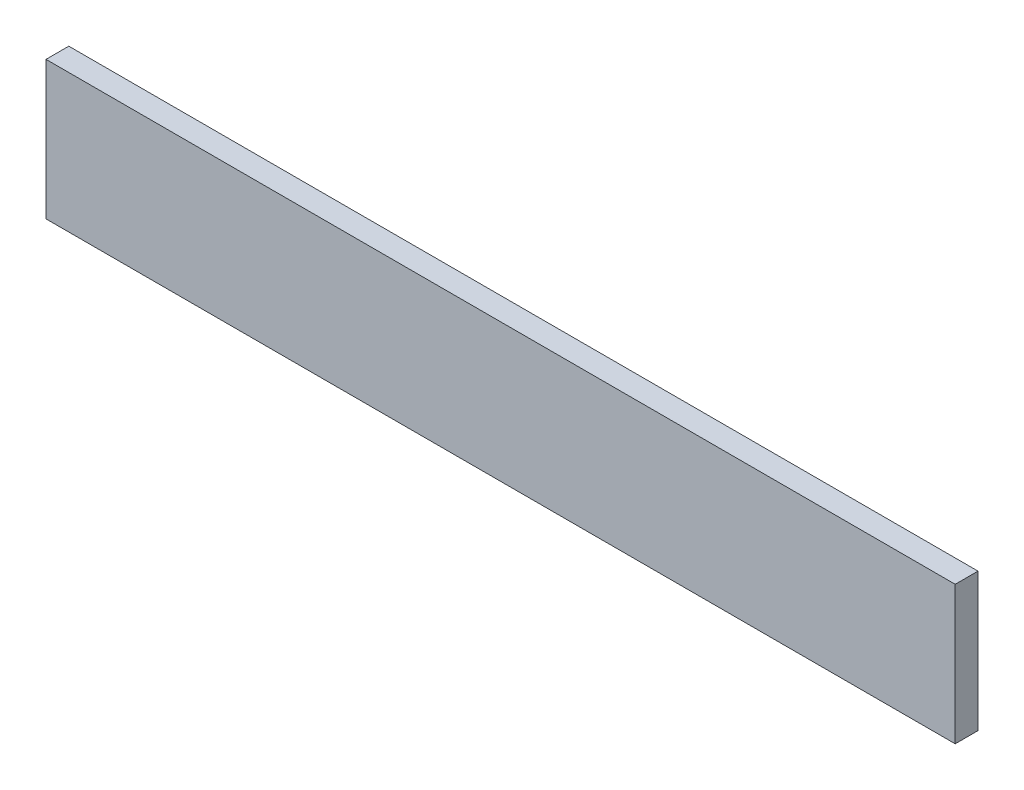
ISO-10303-21;
HEADER;
FILE_DESCRIPTION(('STEP AP214'),'2;1');
FILE_NAME('part.step','',(''),(''),'','','');
FILE_SCHEMA(('AUTOMOTIVE_DESIGN { 1 0 10303 214 1 1 1 1 }'));
ENDSEC;
DATA;
#1=APPLICATION_CONTEXT('core data for automotive mechanical design processes');
#2=APPLICATION_PROTOCOL_DEFINITION('international standard','automotive_design',2000,#1);
#3=PRODUCT_CONTEXT('',#1,'mechanical');
#4=PRODUCT('Part','Part','',(#3));
#5=PRODUCT_RELATED_PRODUCT_CATEGORY('part','',(#4));
#6=PRODUCT_DEFINITION_FORMATION('','',#4);
#7=PRODUCT_DEFINITION_CONTEXT('part definition',#1,'design');
#8=PRODUCT_DEFINITION('design','',#6,#7);
#9=PRODUCT_DEFINITION_SHAPE('','',#8);
#10=(LENGTH_UNIT() NAMED_UNIT(*) SI_UNIT(.MILLI.,.METRE.));
#11=(NAMED_UNIT(*) PLANE_ANGLE_UNIT() SI_UNIT($,.RADIAN.));
#12=(NAMED_UNIT(*) SI_UNIT($,.STERADIAN.) SOLID_ANGLE_UNIT());
#13=UNCERTAINTY_MEASURE_WITH_UNIT(LENGTH_MEASURE(1.E-05),#10,'distance_accuracy_value','');
#14=(GEOMETRIC_REPRESENTATION_CONTEXT(3) GLOBAL_UNCERTAINTY_ASSIGNED_CONTEXT((#13)) GLOBAL_UNIT_ASSIGNED_CONTEXT((#10,
#11,#12)) REPRESENTATION_CONTEXT('',''));
#15=CARTESIAN_POINT('',(0.,0.,0.));
#16=DIRECTION('',(0.,0.,1.));
#17=DIRECTION('',(1.,0.,0.));
#18=AXIS2_PLACEMENT_3D('',#15,#16,#17);
#19=CARTESIAN_POINT('',(-789.6,-60.,-9.9));
#20=DIRECTION('',(0.,0.,-1.));
#21=DIRECTION('',(-1.,0.,0.));
#22=AXIS2_PLACEMENT_3D('',#19,#20,#21);
#23=PLANE('',#22);
#24=DIRECTION('',(0.,1.,0.));
#25=VECTOR('',#24,1.);
#26=CARTESIAN_POINT('',(0.,-60.,-9.9));
#27=LINE('',#26,#25);
#28=CARTESIAN_POINT('',(0.,-60.,-9.9));
#29=VERTEX_POINT('',#28);
#30=CARTESIAN_POINT('',(0.,60.,-9.9));
#31=VERTEX_POINT('',#30);
#32=EDGE_CURVE('E98',#29,#31,#27,.T.);
#33=ORIENTED_EDGE('',*,*,#32,.F.);
#34=DIRECTION('',(1.,0.,0.));
#35=VECTOR('',#34,1.);
#36=CARTESIAN_POINT('',(-789.6,-60.,-9.9));
#37=LINE('',#36,#35);
#38=CARTESIAN_POINT('',(-789.6,-60.,-9.9));
#39=VERTEX_POINT('',#38);
#40=EDGE_CURVE('E11',#39,#29,#37,.T.);
#41=ORIENTED_EDGE('',*,*,#40,.F.);
#42=DIRECTION('',(0.,1.,0.));
#43=VECTOR('',#42,1.);
#44=CARTESIAN_POINT('',(-789.6,-60.,-9.9));
#45=LINE('',#44,#43);
#46=CARTESIAN_POINT('',(-789.6,60.,-9.9));
#47=VERTEX_POINT('',#46);
#48=EDGE_CURVE('E92',#39,#47,#45,.T.);
#49=ORIENTED_EDGE('',*,*,#48,.T.);
#50=DIRECTION('',(1.,0.,0.));
#51=VECTOR('',#50,1.);
#52=CARTESIAN_POINT('',(-789.6,60.,-9.9));
#53=LINE('',#52,#51);
#54=EDGE_CURVE('E37',#47,#31,#53,.T.);
#55=ORIENTED_EDGE('',*,*,#54,.T.);
#56=EDGE_LOOP('',(#33,#41,#49,#55));
#57=FACE_BOUND('',#56,.T.);
#58=ADVANCED_FACE('F34',(#57),#23,.T.);
#59=CARTESIAN_POINT('',(-789.6,-60.,9.9));
#60=DIRECTION('',(0.,-1.,0.));
#61=DIRECTION('',(0.,0.,-1.));
#62=AXIS2_PLACEMENT_3D('',#59,#60,#61);
#63=PLANE('',#62);
#64=DIRECTION('',(0.,0.,-1.));
#65=VECTOR('',#64,1.);
#66=CARTESIAN_POINT('',(0.,-60.,9.9));
#67=LINE('',#66,#65);
#68=CARTESIAN_POINT('',(0.,-60.,9.9));
#69=VERTEX_POINT('',#68);
#70=EDGE_CURVE('E94',#69,#29,#67,.T.);
#71=ORIENTED_EDGE('',*,*,#70,.F.);
#72=DIRECTION('',(1.,0.,0.));
#73=VECTOR('',#72,1.);
#74=CARTESIAN_POINT('',(-789.6,-60.,9.9));
#75=LINE('',#74,#73);
#76=CARTESIAN_POINT('',(-789.6,-60.,9.9));
#77=VERTEX_POINT('',#76);
#78=EDGE_CURVE('E43',#77,#69,#75,.T.);
#79=ORIENTED_EDGE('',*,*,#78,.F.);
#80=DIRECTION('',(0.,0.,-1.));
#81=VECTOR('',#80,1.);
#82=CARTESIAN_POINT('',(-789.6,-60.,9.9));
#83=LINE('',#82,#81);
#84=EDGE_CURVE('E89',#77,#39,#83,.T.);
#85=ORIENTED_EDGE('',*,*,#84,.T.);
#86=ORIENTED_EDGE('',*,*,#40,.T.);
#87=EDGE_LOOP('',(#71,#79,#85,#86));
#88=FACE_BOUND('',#87,.T.);
#89=ADVANCED_FACE('F108',(#88),#63,.T.);
#90=CARTESIAN_POINT('',(-789.6,-60.,9.9));
#91=DIRECTION('',(0.,0.,1.));
#92=DIRECTION('',(1.,0.,0.));
#93=AXIS2_PLACEMENT_3D('',#90,#91,#92);
#94=PLANE('',#93);
#95=DIRECTION('',(0.,-1.,0.));
#96=VECTOR('',#95,1.);
#97=CARTESIAN_POINT('',(0.,-60.,9.9));
#98=LINE('',#97,#96);
#99=CARTESIAN_POINT('',(0.,60.,9.9));
#100=VERTEX_POINT('',#99);
#101=EDGE_CURVE('E84',#100,#69,#98,.T.);
#102=ORIENTED_EDGE('',*,*,#101,.F.);
#103=DIRECTION('',(1.,0.,0.));
#104=VECTOR('',#103,1.);
#105=CARTESIAN_POINT('',(-789.6,60.,9.9));
#106=LINE('',#105,#104);
#107=CARTESIAN_POINT('',(-789.6,60.,9.9));
#108=VERTEX_POINT('',#107);
#109=EDGE_CURVE('E79',#108,#100,#106,.T.);
#110=ORIENTED_EDGE('',*,*,#109,.F.);
#111=DIRECTION('',(0.,-1.,0.));
#112=VECTOR('',#111,1.);
#113=CARTESIAN_POINT('',(-789.6,-60.,9.9));
#114=LINE('',#113,#112);
#115=EDGE_CURVE('E82',#108,#77,#114,.T.);
#116=ORIENTED_EDGE('',*,*,#115,.T.);
#117=ORIENTED_EDGE('',*,*,#78,.T.);
#118=EDGE_LOOP('',(#102,#110,#116,#117));
#119=FACE_BOUND('',#118,.T.);
#120=ADVANCED_FACE('F81',(#119),#94,.T.);
#121=CARTESIAN_POINT('',(-789.6,60.,9.9));
#122=DIRECTION('',(0.,1.,0.));
#123=DIRECTION('',(0.,0.,1.));
#124=AXIS2_PLACEMENT_3D('',#121,#122,#123);
#125=PLANE('',#124);
#126=DIRECTION('',(0.,0.,1.));
#127=VECTOR('',#126,1.);
#128=CARTESIAN_POINT('',(0.,60.,9.9));
#129=LINE('',#128,#127);
#130=EDGE_CURVE('E101',#31,#100,#129,.T.);
#131=ORIENTED_EDGE('',*,*,#130,.F.);
#132=ORIENTED_EDGE('',*,*,#54,.F.);
#133=DIRECTION('',(0.,0.,1.));
#134=VECTOR('',#133,1.);
#135=CARTESIAN_POINT('',(-789.6,60.,9.9));
#136=LINE('',#135,#134);
#137=EDGE_CURVE('E88',#47,#108,#136,.T.);
#138=ORIENTED_EDGE('',*,*,#137,.T.);
#139=ORIENTED_EDGE('',*,*,#109,.T.);
#140=EDGE_LOOP('',(#131,#132,#138,#139));
#141=FACE_BOUND('',#140,.T.);
#142=ADVANCED_FACE('F91',(#141),#125,.T.);
#143=CARTESIAN_POINT('',(-789.6,0.,0.));
#144=DIRECTION('',(-1.,0.,0.));
#145=DIRECTION('',(0.,0.,1.));
#146=AXIS2_PLACEMENT_3D('',#143,#144,#145);
#147=PLANE('',#146);
#148=ORIENTED_EDGE('',*,*,#48,.F.);
#149=ORIENTED_EDGE('',*,*,#84,.F.);
#150=ORIENTED_EDGE('',*,*,#115,.F.);
#151=ORIENTED_EDGE('',*,*,#137,.F.);
#152=EDGE_LOOP('',(#148,#149,#150,#151));
#153=FACE_BOUND('',#152,.T.);
#154=ADVANCED_FACE('F87',(#153),#147,.T.);
#155=CARTESIAN_POINT('',(0.,0.,0.));
#156=DIRECTION('',(-1.,0.,0.));
#157=DIRECTION('',(0.,0.,1.));
#158=AXIS2_PLACEMENT_3D('',#155,#156,#157);
#159=PLANE('',#158);
#160=ORIENTED_EDGE('',*,*,#32,.T.);
#161=ORIENTED_EDGE('',*,*,#130,.T.);
#162=ORIENTED_EDGE('',*,*,#101,.T.);
#163=ORIENTED_EDGE('',*,*,#70,.T.);
#164=EDGE_LOOP('',(#160,#161,#162,#163));
#165=FACE_BOUND('',#164,.T.);
#166=ADVANCED_FACE('F107',(#165),#159,.F.);
#167=CLOSED_SHELL('',(#58,#89,#120,#142,#154,#166));
#168=MANIFOLD_SOLID_BREP('B2',#167);
#169=ADVANCED_BREP_SHAPE_REPRESENTATION('',(#18,#168),#14);
#170=SHAPE_DEFINITION_REPRESENTATION(#9,#169);
ENDSEC;
END-ISO-10303-21;
